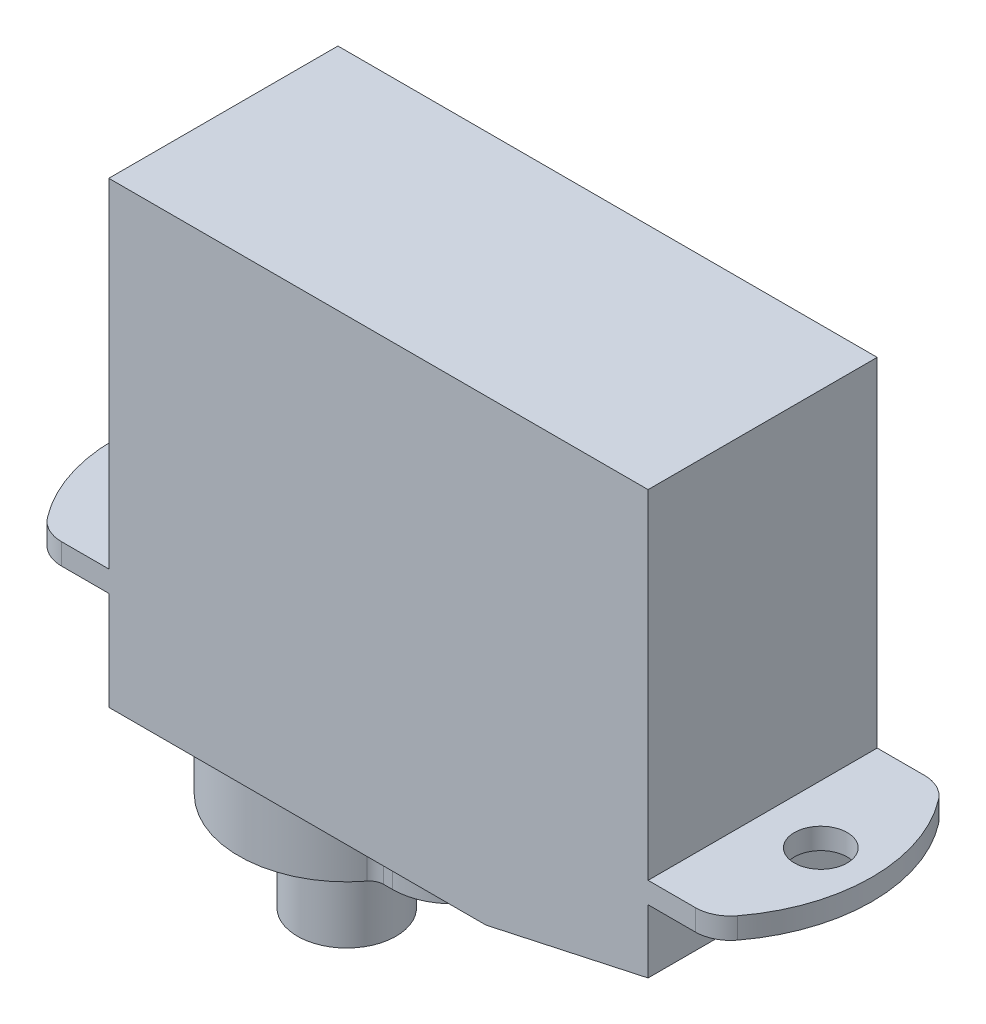
ISO-10303-21;
HEADER;
FILE_DESCRIPTION(('STEP AP214'),'2;1');
FILE_NAME('part.step','',(''),(''),'','','');
FILE_SCHEMA(('AUTOMOTIVE_DESIGN { 1 0 10303 214 1 1 1 1 }'));
ENDSEC;
DATA;
#1=APPLICATION_CONTEXT('core data for automotive mechanical design processes');
#2=APPLICATION_PROTOCOL_DEFINITION('international standard','automotive_design',2000,#1);
#3=PRODUCT_CONTEXT('',#1,'mechanical');
#4=PRODUCT('Part','Part','',(#3));
#5=PRODUCT_RELATED_PRODUCT_CATEGORY('part','',(#4));
#6=PRODUCT_DEFINITION_FORMATION('','',#4);
#7=PRODUCT_DEFINITION_CONTEXT('part definition',#1,'design');
#8=PRODUCT_DEFINITION('design','',#6,#7);
#9=PRODUCT_DEFINITION_SHAPE('','',#8);
#10=(LENGTH_UNIT() NAMED_UNIT(*) SI_UNIT(.MILLI.,.METRE.));
#11=(NAMED_UNIT(*) PLANE_ANGLE_UNIT() SI_UNIT($,.RADIAN.));
#12=(NAMED_UNIT(*) SI_UNIT($,.STERADIAN.) SOLID_ANGLE_UNIT());
#13=UNCERTAINTY_MEASURE_WITH_UNIT(LENGTH_MEASURE(1.E-05),#10,'distance_accuracy_value','');
#14=(GEOMETRIC_REPRESENTATION_CONTEXT(3) GLOBAL_UNCERTAINTY_ASSIGNED_CONTEXT((#13)) GLOBAL_UNIT_ASSIGNED_CONTEXT((#10,
#11,#12)) REPRESENTATION_CONTEXT('',''));
#15=CARTESIAN_POINT('',(0.,0.,0.));
#16=DIRECTION('',(0.,0.,1.));
#17=DIRECTION('',(1.,0.,0.));
#18=AXIS2_PLACEMENT_3D('',#15,#16,#17);
#19=CARTESIAN_POINT('',(-1.77820782436521,-2.54,-2.667));
#20=DIRECTION('',(0.,-1.,0.));
#21=DIRECTION('',(0.,0.,-1.));
#22=AXIS2_PLACEMENT_3D('',#19,#20,#21);
#23=PLANE('',#22);
#24=CARTESIAN_POINT('',(-1.77820782436521,-2.54,-2.667));
#25=DIRECTION('',(0.,1.,0.));
#26=DIRECTION('',(0.,0.,-1.));
#27=AXIS2_PLACEMENT_3D('',#24,#25,#26);
#28=CIRCLE('',#27,0.508);
#29=CARTESIAN_POINT('',(-2.18194102386056,-2.54,-2.35867630057804));
#30=VERTEX_POINT('',#29);
#31=CARTESIAN_POINT('',(-1.77820782436521,-2.54,-2.159));
#32=VERTEX_POINT('',#31);
#33=EDGE_CURVE('E201',#30,#32,#28,.T.);
#34=ORIENTED_EDGE('',*,*,#33,.T.);
#35=DIRECTION('',(1.,0.,0.));
#36=VECTOR('',#35,1.);
#37=CARTESIAN_POINT('',(-1.4605,-2.54,-2.159));
#38=LINE('',#37,#36);
#39=CARTESIAN_POINT('',(-1.4605,-2.54,-2.159));
#40=VERTEX_POINT('',#39);
#41=EDGE_CURVE('E190',#32,#40,#38,.T.);
#42=ORIENTED_EDGE('',*,*,#41,.T.);
#43=CARTESIAN_POINT('',(-1.4605,-2.54,0.));
#44=DIRECTION('',(0.,-1.,0.));
#45=DIRECTION('',(0.,0.,-1.));
#46=AXIS2_PLACEMENT_3D('',#43,#44,#45);
#47=CIRCLE('',#46,2.159);
#48=CARTESIAN_POINT('',(-1.4605,-2.54,2.159));
#49=VERTEX_POINT('',#48);
#50=EDGE_CURVE('E200',#40,#49,#47,.T.);
#51=ORIENTED_EDGE('',*,*,#50,.T.);
#52=DIRECTION('',(-1.,0.,0.));
#53=VECTOR('',#52,1.);
#54=CARTESIAN_POINT('',(-1.4605,-2.54,2.159));
#55=LINE('',#54,#53);
#56=CARTESIAN_POINT('',(-1.77820782436521,-2.54,2.159));
#57=VERTEX_POINT('',#56);
#58=EDGE_CURVE('E752',#49,#57,#55,.T.);
#59=ORIENTED_EDGE('',*,*,#58,.T.);
#60=CARTESIAN_POINT('',(-1.77820782436521,-2.54,2.667));
#61=DIRECTION('',(0.,1.,0.));
#62=DIRECTION('',(0.,0.,1.));
#63=AXIS2_PLACEMENT_3D('',#60,#61,#62);
#64=CIRCLE('',#63,0.508);
#65=CARTESIAN_POINT('',(-2.18194102386056,-2.54,2.35867630057803));
#66=VERTEX_POINT('',#65);
#67=EDGE_CURVE('E754',#57,#66,#64,.T.);
#68=ORIENTED_EDGE('',*,*,#67,.T.);
#69=CARTESIAN_POINT('',(-5.2705,-2.54,0.));
#70=DIRECTION('',(0.,-1.,0.));
#71=DIRECTION('',(0.,0.,-1.));
#72=AXIS2_PLACEMENT_3D('',#69,#70,#71);
#73=CIRCLE('',#72,3.8862);
#74=EDGE_CURVE('E206',#66,#30,#73,.T.);
#75=ORIENTED_EDGE('',*,*,#74,.T.);
#76=EDGE_LOOP('',(#34,#42,#51,#59,#68,#75));
#77=FACE_BOUND('',#76,.T.);
#78=CARTESIAN_POINT('',(-5.2705,-2.54,0.));
#79=DIRECTION('',(0.,-1.,0.));
#80=DIRECTION('',(0.,0.,-1.));
#81=AXIS2_PLACEMENT_3D('',#78,#79,#80);
#82=CIRCLE('',#81,1.778);
#83=CARTESIAN_POINT('',(-5.2705,-2.54,-1.778));
#84=VERTEX_POINT('',#83);
#85=EDGE_CURVE('E745',#84,#84,#82,.T.);
#86=ORIENTED_EDGE('',*,*,#85,.F.);
#87=EDGE_LOOP('',(#86));
#88=FACE_BOUND('',#87,.T.);
#89=ADVANCED_FACE('F35',(#77,#88),#23,.T.);
#90=CARTESIAN_POINT('',(0.,0.,0.));
#91=DIRECTION('',(0.,1.,0.));
#92=DIRECTION('',(0.,0.,1.));
#93=AXIS2_PLACEMENT_3D('',#90,#91,#92);
#94=PLANE('',#93);
#95=DIRECTION('',(-1.,0.,0.));
#96=VECTOR('',#95,1.);
#97=CARTESIAN_POINT('',(9.7155,0.,-4.1275));
#98=LINE('',#97,#96);
#99=CARTESIAN_POINT('',(3.87350000000001,0.,-4.1275025));
#100=VERTEX_POINT('',#99);
#101=CARTESIAN_POINT('',(-9.7155,0.,-4.1275));
#102=VERTEX_POINT('',#101);
#103=EDGE_CURVE('E39',#100,#102,#98,.T.);
#104=ORIENTED_EDGE('',*,*,#103,.F.);
#105=DIRECTION('',(0.,0.,1.));
#106=VECTOR('',#105,1.);
#107=CARTESIAN_POINT('',(3.8735,0.,0.));
#108=LINE('',#107,#106);
#109=CARTESIAN_POINT('',(3.8735,0.,4.1275));
#110=VERTEX_POINT('',#109);
#111=EDGE_CURVE('E11',#100,#110,#108,.T.);
#112=ORIENTED_EDGE('',*,*,#111,.T.);
#113=DIRECTION('',(1.,0.,0.));
#114=VECTOR('',#113,1.);
#115=CARTESIAN_POINT('',(9.7155,0.,4.1275));
#116=LINE('',#115,#114);
#117=CARTESIAN_POINT('',(-9.7155,0.,4.1275));
#118=VERTEX_POINT('',#117);
#119=EDGE_CURVE('E332',#118,#110,#116,.T.);
#120=ORIENTED_EDGE('',*,*,#119,.F.);
#121=DIRECTION('',(0.,0.,1.));
#122=VECTOR('',#121,1.);
#123=CARTESIAN_POINT('',(-9.7155,0.,4.1275));
#124=LINE('',#123,#122);
#125=EDGE_CURVE('E314',#102,#118,#124,.T.);
#126=ORIENTED_EDGE('',*,*,#125,.F.);
#127=EDGE_LOOP('',(#104,#112,#120,#126));
#128=FACE_BOUND('',#127,.T.);
#129=CARTESIAN_POINT('',(-1.77820782436521,0.,-2.667));
#130=DIRECTION('',(0.,1.,0.));
#131=DIRECTION('',(0.,0.,-1.));
#132=AXIS2_PLACEMENT_3D('',#129,#130,#131);
#133=CIRCLE('',#132,0.508);
#134=CARTESIAN_POINT('',(-2.18194102386056,0.,-2.35867630057804));
#135=VERTEX_POINT('',#134);
#136=CARTESIAN_POINT('',(-1.77820782436521,0.,-2.159));
#137=VERTEX_POINT('',#136);
#138=EDGE_CURVE('E213',#135,#137,#133,.T.);
#139=ORIENTED_EDGE('',*,*,#138,.F.);
#140=CARTESIAN_POINT('',(-5.2705,0.,0.));
#141=DIRECTION('',(0.,-1.,0.));
#142=DIRECTION('',(0.,0.,-1.));
#143=AXIS2_PLACEMENT_3D('',#140,#141,#142);
#144=CIRCLE('',#143,3.8862);
#145=CARTESIAN_POINT('',(-2.18194102386056,0.,2.35867630057803));
#146=VERTEX_POINT('',#145);
#147=EDGE_CURVE('E210',#146,#135,#144,.T.);
#148=ORIENTED_EDGE('',*,*,#147,.F.);
#149=CARTESIAN_POINT('',(-1.77820782436521,0.,2.667));
#150=DIRECTION('',(0.,1.,0.));
#151=DIRECTION('',(0.,0.,1.));
#152=AXIS2_PLACEMENT_3D('',#149,#150,#151);
#153=CIRCLE('',#152,0.508);
#154=CARTESIAN_POINT('',(-1.77820782436521,0.,2.159));
#155=VERTEX_POINT('',#154);
#156=EDGE_CURVE('E763',#155,#146,#153,.T.);
#157=ORIENTED_EDGE('',*,*,#156,.F.);
#158=DIRECTION('',(-1.,0.,0.));
#159=VECTOR('',#158,1.);
#160=CARTESIAN_POINT('',(-1.4605,0.,2.159));
#161=LINE('',#160,#159);
#162=CARTESIAN_POINT('',(-1.4605,0.,2.159));
#163=VERTEX_POINT('',#162);
#164=EDGE_CURVE('E760',#163,#155,#161,.T.);
#165=ORIENTED_EDGE('',*,*,#164,.F.);
#166=CARTESIAN_POINT('',(-1.4605,0.,0.));
#167=DIRECTION('',(0.,-1.,0.));
#168=DIRECTION('',(0.,0.,-1.));
#169=AXIS2_PLACEMENT_3D('',#166,#167,#168);
#170=CIRCLE('',#169,2.159);
#171=CARTESIAN_POINT('',(-1.4605,0.,-2.159));
#172=VERTEX_POINT('',#171);
#173=EDGE_CURVE('E58',#172,#163,#170,.T.);
#174=ORIENTED_EDGE('',*,*,#173,.F.);
#175=DIRECTION('',(1.,0.,0.));
#176=VECTOR('',#175,1.);
#177=CARTESIAN_POINT('',(-1.4605,0.,-2.159));
#178=LINE('',#177,#176);
#179=EDGE_CURVE('E53',#137,#172,#178,.T.);
#180=ORIENTED_EDGE('',*,*,#179,.F.);
#181=EDGE_LOOP('',(#139,#148,#157,#165,#174,#180));
#182=FACE_BOUND('',#181,.T.);
#183=ADVANCED_FACE('F379',(#128,#182),#94,.F.);
#184=CARTESIAN_POINT('',(-9.7155,16.51,4.1275));
#185=DIRECTION('',(1.,0.,0.));
#186=DIRECTION('',(0.,0.,-1.));
#187=AXIS2_PLACEMENT_3D('',#184,#185,#186);
#188=PLANE('',#187);
#189=DIRECTION('',(0.,0.,-1.));
#190=VECTOR('',#189,1.);
#191=CARTESIAN_POINT('',(-9.7155,4.318,-4.1275));
#192=LINE('',#191,#190);
#193=CARTESIAN_POINT('',(-9.7155,4.318,4.1275));
#194=VERTEX_POINT('',#193);
#195=CARTESIAN_POINT('',(-9.7155,4.318,-4.1275));
#196=VERTEX_POINT('',#195);
#197=EDGE_CURVE('E239',#194,#196,#192,.T.);
#198=ORIENTED_EDGE('',*,*,#197,.F.);
#199=DIRECTION('',(0.,-1.,0.));
#200=VECTOR('',#199,1.);
#201=CARTESIAN_POINT('',(-9.7155,16.51,4.1275));
#202=LINE('',#201,#200);
#203=CARTESIAN_POINT('',(-9.7155,16.51,4.1275));
#204=VERTEX_POINT('',#203);
#205=EDGE_CURVE('E45',#204,#194,#202,.T.);
#206=ORIENTED_EDGE('',*,*,#205,.F.);
#207=DIRECTION('',(0.,0.,1.));
#208=VECTOR('',#207,1.);
#209=CARTESIAN_POINT('',(-9.7155,16.51,4.1275));
#210=LINE('',#209,#208);
#211=CARTESIAN_POINT('',(-9.7155,16.51,-4.1275));
#212=VERTEX_POINT('',#211);
#213=EDGE_CURVE('E320',#212,#204,#210,.T.);
#214=ORIENTED_EDGE('',*,*,#213,.F.);
#215=DIRECTION('',(0.,-1.,0.));
#216=VECTOR('',#215,1.);
#217=CARTESIAN_POINT('',(-9.7155,16.51,-4.1275));
#218=LINE('',#217,#216);
#219=EDGE_CURVE('E343',#212,#196,#218,.T.);
#220=ORIENTED_EDGE('',*,*,#219,.T.);
#221=EDGE_LOOP('',(#198,#206,#214,#220));
#222=FACE_BOUND('',#221,.T.);
#223=ADVANCED_FACE('F418',(#222),#188,.F.);
#224=CARTESIAN_POINT('',(9.7155,16.51,4.1275));
#225=DIRECTION('',(-1.,0.,0.));
#226=DIRECTION('',(0.,0.,1.));
#227=AXIS2_PLACEMENT_3D('',#224,#225,#226);
#228=PLANE('',#227);
#229=DIRECTION('',(0.,0.,1.));
#230=VECTOR('',#229,1.);
#231=CARTESIAN_POINT('',(9.7155,4.318,4.1275));
#232=LINE('',#231,#230);
#233=CARTESIAN_POINT('',(9.7155,4.318,-4.1275));
#234=VERTEX_POINT('',#233);
#235=CARTESIAN_POINT('',(9.7155,4.318,4.1275));
#236=VERTEX_POINT('',#235);
#237=EDGE_CURVE('E294',#234,#236,#232,.T.);
#238=ORIENTED_EDGE('',*,*,#237,.F.);
#239=DIRECTION('',(0.,-1.,0.));
#240=VECTOR('',#239,1.);
#241=CARTESIAN_POINT('',(9.7155,16.51,-4.1275));
#242=LINE('',#241,#240);
#243=CARTESIAN_POINT('',(9.7155,16.51,-4.1275));
#244=VERTEX_POINT('',#243);
#245=EDGE_CURVE('E354',#244,#234,#242,.T.);
#246=ORIENTED_EDGE('',*,*,#245,.F.);
#247=DIRECTION('',(0.,0.,-1.));
#248=VECTOR('',#247,1.);
#249=CARTESIAN_POINT('',(9.7155,16.51,4.1275));
#250=LINE('',#249,#248);
#251=CARTESIAN_POINT('',(9.7155,16.51,4.1275));
#252=VERTEX_POINT('',#251);
#253=EDGE_CURVE('E325',#252,#244,#250,.T.);
#254=ORIENTED_EDGE('',*,*,#253,.F.);
#255=DIRECTION('',(0.,-1.,0.));
#256=VECTOR('',#255,1.);
#257=CARTESIAN_POINT('',(9.7155,16.51,4.1275));
#258=LINE('',#257,#256);
#259=EDGE_CURVE('E350',#252,#236,#258,.T.);
#260=ORIENTED_EDGE('',*,*,#259,.T.);
#261=EDGE_LOOP('',(#238,#246,#254,#260));
#262=FACE_BOUND('',#261,.T.);
#263=ADVANCED_FACE('F668',(#262),#228,.F.);
#264=CARTESIAN_POINT('',(-9.7155,3.556,4.1275));
#265=VERTEX_POINT('',#264);
#266=EDGE_CURVE('E347',#265,#118,#202,.T.);
#267=ORIENTED_EDGE('',*,*,#266,.F.);
#268=DIRECTION('',(0.,0.,-1.));
#269=VECTOR('',#268,1.);
#270=CARTESIAN_POINT('',(-9.7155,3.556,-4.1275));
#271=LINE('',#270,#269);
#272=CARTESIAN_POINT('',(-9.7155,3.556,-4.1275));
#273=VERTEX_POINT('',#272);
#274=EDGE_CURVE('E261',#265,#273,#271,.T.);
#275=ORIENTED_EDGE('',*,*,#274,.T.);
#276=EDGE_CURVE('E329',#273,#102,#218,.T.);
#277=ORIENTED_EDGE('',*,*,#276,.T.);
#278=ORIENTED_EDGE('',*,*,#125,.T.);
#279=EDGE_LOOP('',(#267,#275,#277,#278));
#280=FACE_BOUND('',#279,.T.);
#281=ADVANCED_FACE('F37',(#280),#188,.F.);
#282=CARTESIAN_POINT('',(9.7155,16.51,4.1275));
#283=DIRECTION('',(0.,0.,-1.));
#284=DIRECTION('',(-1.,0.,0.));
#285=AXIS2_PLACEMENT_3D('',#282,#283,#284);
#286=PLANE('',#285);
#287=ORIENTED_EDGE('',*,*,#119,.T.);
#288=DIRECTION('',(-0.977176363922801,-0.212429644331044,0.));
#289=VECTOR('',#288,1.);
#290=CARTESIAN_POINT('',(9.7155,1.27,4.1275));
#291=LINE('',#290,#289);
#292=CARTESIAN_POINT('',(9.7155,1.27,4.1275));
#293=VERTEX_POINT('',#292);
#294=EDGE_CURVE('E214',#293,#110,#291,.T.);
#295=ORIENTED_EDGE('',*,*,#294,.F.);
#296=CARTESIAN_POINT('',(9.7155,3.556,4.1275));
#297=VERTEX_POINT('',#296);
#298=EDGE_CURVE('E289',#297,#293,#258,.T.);
#299=ORIENTED_EDGE('',*,*,#298,.F.);
#300=DIRECTION('',(1.,0.,0.));
#301=VECTOR('',#300,1.);
#302=CARTESIAN_POINT('',(9.7155,3.556,4.1275));
#303=LINE('',#302,#301);
#304=CARTESIAN_POINT('',(11.4179236568572,3.556,4.1275));
#305=VERTEX_POINT('',#304);
#306=EDGE_CURVE('E272',#297,#305,#303,.T.);
#307=ORIENTED_EDGE('',*,*,#306,.T.);
#308=DIRECTION('',(0.,1.,0.));
#309=VECTOR('',#308,1.);
#310=CARTESIAN_POINT('',(11.4179236568572,3.556,4.1275));
#311=LINE('',#310,#309);
#312=CARTESIAN_POINT('',(11.4179236568572,4.318,4.1275));
#313=VERTEX_POINT('',#312);
#314=EDGE_CURVE('E288',#305,#313,#311,.T.);
#315=ORIENTED_EDGE('',*,*,#314,.T.);
#316=DIRECTION('',(1.,0.,0.));
#317=VECTOR('',#316,1.);
#318=CARTESIAN_POINT('',(9.7155,4.318,4.1275));
#319=LINE('',#318,#317);
#320=EDGE_CURVE('E265',#236,#313,#319,.T.);
#321=ORIENTED_EDGE('',*,*,#320,.F.);
#322=ORIENTED_EDGE('',*,*,#259,.F.);
#323=DIRECTION('',(1.,0.,0.));
#324=VECTOR('',#323,1.);
#325=CARTESIAN_POINT('',(9.7155,16.51,4.1275));
#326=LINE('',#325,#324);
#327=EDGE_CURVE('E323',#204,#252,#326,.T.);
#328=ORIENTED_EDGE('',*,*,#327,.F.);
#329=ORIENTED_EDGE('',*,*,#205,.T.);
#330=DIRECTION('',(1.,0.,0.));
#331=VECTOR('',#330,1.);
#332=CARTESIAN_POINT('',(-9.7155,4.318,4.1275));
#333=LINE('',#332,#331);
#334=CARTESIAN_POINT('',(-11.4179236568572,4.318,4.1275));
#335=VERTEX_POINT('',#334);
#336=EDGE_CURVE('E244',#335,#194,#333,.T.);
#337=ORIENTED_EDGE('',*,*,#336,.F.);
#338=DIRECTION('',(0.,1.,0.));
#339=VECTOR('',#338,1.);
#340=CARTESIAN_POINT('',(-11.4179236568572,3.556,4.1275));
#341=LINE('',#340,#339);
#342=CARTESIAN_POINT('',(-11.4179236568572,3.556,4.1275));
#343=VERTEX_POINT('',#342);
#344=EDGE_CURVE('E252',#343,#335,#341,.T.);
#345=ORIENTED_EDGE('',*,*,#344,.F.);
#346=DIRECTION('',(1.,0.,0.));
#347=VECTOR('',#346,1.);
#348=CARTESIAN_POINT('',(-9.7155,3.556,4.1275));
#349=LINE('',#348,#347);
#350=EDGE_CURVE('E392',#343,#265,#349,.T.);
#351=ORIENTED_EDGE('',*,*,#350,.T.);
#352=ORIENTED_EDGE('',*,*,#266,.T.);
#353=EDGE_LOOP('',(#287,#295,#299,#307,#315,#321,#322,#328,#329,#337,#345,#351,#352));
#354=FACE_BOUND('',#353,.T.);
#355=ADVANCED_FACE('F373',(#354),#286,.F.);
#356=ORIENTED_EDGE('',*,*,#298,.T.);
#357=DIRECTION('',(0.,0.,1.));
#358=VECTOR('',#357,1.);
#359=CARTESIAN_POINT('',(9.7155,1.27,-4.12755));
#360=LINE('',#359,#358);
#361=CARTESIAN_POINT('',(9.7155,1.27,-4.1275));
#362=VERTEX_POINT('',#361);
#363=EDGE_CURVE('E216',#362,#293,#360,.T.);
#364=ORIENTED_EDGE('',*,*,#363,.F.);
#365=CARTESIAN_POINT('',(9.7155,3.556,-4.1275));
#366=VERTEX_POINT('',#365);
#367=EDGE_CURVE('E346',#366,#362,#242,.T.);
#368=ORIENTED_EDGE('',*,*,#367,.F.);
#369=DIRECTION('',(0.,0.,1.));
#370=VECTOR('',#369,1.);
#371=CARTESIAN_POINT('',(9.7155,3.556,4.1275));
#372=LINE('',#371,#370);
#373=EDGE_CURVE('E284',#366,#297,#372,.T.);
#374=ORIENTED_EDGE('',*,*,#373,.T.);
#375=EDGE_LOOP('',(#356,#364,#368,#374));
#376=FACE_BOUND('',#375,.T.);
#377=ADVANCED_FACE('F368',(#376),#228,.F.);
#378=CARTESIAN_POINT('',(9.7155,16.51,-4.1275));
#379=DIRECTION('',(0.,0.,1.));
#380=DIRECTION('',(1.,0.,0.));
#381=AXIS2_PLACEMENT_3D('',#378,#379,#380);
#382=PLANE('',#381);
#383=ORIENTED_EDGE('',*,*,#367,.T.);
#384=DIRECTION('',(-0.977176363922801,-0.212429644331044,0.));
#385=VECTOR('',#384,1.);
#386=CARTESIAN_POINT('',(12.8790379061372,1.95772563176896,-4.1275));
#387=LINE('',#386,#385);
#388=EDGE_CURVE('E223',#362,#100,#387,.T.);
#389=ORIENTED_EDGE('',*,*,#388,.T.);
#390=ORIENTED_EDGE('',*,*,#103,.T.);
#391=ORIENTED_EDGE('',*,*,#276,.F.);
#392=DIRECTION('',(-1.,0.,0.));
#393=VECTOR('',#392,1.);
#394=CARTESIAN_POINT('',(-9.7155,3.556,-4.1275));
#395=LINE('',#394,#393);
#396=CARTESIAN_POINT('',(-11.4179236568572,3.556,-4.1275));
#397=VERTEX_POINT('',#396);
#398=EDGE_CURVE('E243',#273,#397,#395,.T.);
#399=ORIENTED_EDGE('',*,*,#398,.T.);
#400=DIRECTION('',(0.,1.,0.));
#401=VECTOR('',#400,1.);
#402=CARTESIAN_POINT('',(-11.4179236568572,3.556,-4.1275));
#403=LINE('',#402,#401);
#404=CARTESIAN_POINT('',(-11.4179236568572,4.318,-4.1275));
#405=VERTEX_POINT('',#404);
#406=EDGE_CURVE('E259',#397,#405,#403,.T.);
#407=ORIENTED_EDGE('',*,*,#406,.T.);
#408=DIRECTION('',(-1.,0.,0.));
#409=VECTOR('',#408,1.);
#410=CARTESIAN_POINT('',(-9.7155,4.318,-4.1275));
#411=LINE('',#410,#409);
#412=EDGE_CURVE('E235',#196,#405,#411,.T.);
#413=ORIENTED_EDGE('',*,*,#412,.F.);
#414=ORIENTED_EDGE('',*,*,#219,.F.);
#415=DIRECTION('',(-1.,0.,0.));
#416=VECTOR('',#415,1.);
#417=CARTESIAN_POINT('',(9.7155,16.51,-4.1275));
#418=LINE('',#417,#416);
#419=EDGE_CURVE('E327',#244,#212,#418,.T.);
#420=ORIENTED_EDGE('',*,*,#419,.F.);
#421=ORIENTED_EDGE('',*,*,#245,.T.);
#422=DIRECTION('',(-1.,0.,0.));
#423=VECTOR('',#422,1.);
#424=CARTESIAN_POINT('',(9.7155,4.318,-4.1275));
#425=LINE('',#424,#423);
#426=CARTESIAN_POINT('',(11.4179236568572,4.318,-4.1275));
#427=VERTEX_POINT('',#426);
#428=EDGE_CURVE('E300',#427,#234,#425,.T.);
#429=ORIENTED_EDGE('',*,*,#428,.F.);
#430=DIRECTION('',(0.,1.,0.));
#431=VECTOR('',#430,1.);
#432=CARTESIAN_POINT('',(11.4179236568572,3.556,-4.1275));
#433=LINE('',#432,#431);
#434=CARTESIAN_POINT('',(11.4179236568572,3.556,-4.1275));
#435=VERTEX_POINT('',#434);
#436=EDGE_CURVE('E312',#435,#427,#433,.T.);
#437=ORIENTED_EDGE('',*,*,#436,.F.);
#438=DIRECTION('',(-1.,0.,0.));
#439=VECTOR('',#438,1.);
#440=CARTESIAN_POINT('',(9.7155,3.556,-4.1275));
#441=LINE('',#440,#439);
#442=EDGE_CURVE('E278',#435,#366,#441,.T.);
#443=ORIENTED_EDGE('',*,*,#442,.T.);
#444=EDGE_LOOP('',(#383,#389,#390,#391,#399,#407,#413,#414,#420,#421,#429,#437,#443));
#445=FACE_BOUND('',#444,.T.);
#446=ADVANCED_FACE('F384',(#445),#382,.F.);
#447=CARTESIAN_POINT('',(0.,16.51,0.));
#448=DIRECTION('',(0.,1.,0.));
#449=DIRECTION('',(0.,0.,1.));
#450=AXIS2_PLACEMENT_3D('',#447,#448,#449);
#451=PLANE('',#450);
#452=ORIENTED_EDGE('',*,*,#213,.T.);
#453=ORIENTED_EDGE('',*,*,#327,.T.);
#454=ORIENTED_EDGE('',*,*,#253,.T.);
#455=ORIENTED_EDGE('',*,*,#419,.T.);
#456=EDGE_LOOP('',(#452,#453,#454,#455));
#457=FACE_BOUND('',#456,.T.);
#458=ADVANCED_FACE('F422',(#457),#451,.T.);
#459=CARTESIAN_POINT('',(11.4179236568572,3.556,-2.8575));
#460=DIRECTION('',(0.,1.,0.));
#461=DIRECTION('',(0.,0.,1.));
#462=AXIS2_PLACEMENT_3D('',#459,#460,#461);
#463=CYLINDRICAL_SURFACE('',#462,1.27);
#464=CARTESIAN_POINT('',(11.4179236568572,4.318,-2.8575));
#465=DIRECTION('',(0.,1.,0.));
#466=DIRECTION('',(0.,0.,-1.));
#467=AXIS2_PLACEMENT_3D('',#464,#465,#466);
#468=CIRCLE('',#467,1.27);
#469=CARTESIAN_POINT('',(12.4281051132497,4.318,-3.62719696969697));
#470=VERTEX_POINT('',#469);
#471=EDGE_CURVE('E302',#470,#427,#468,.T.);
#472=ORIENTED_EDGE('',*,*,#471,.F.);
#473=DIRECTION('',(0.,1.,0.));
#474=VECTOR('',#473,1.);
#475=CARTESIAN_POINT('',(12.4281051132497,3.556,-3.62719696969697));
#476=LINE('',#475,#474);
#477=CARTESIAN_POINT('',(12.4281051132497,3.556,-3.62719696969697));
#478=VERTEX_POINT('',#477);
#479=EDGE_CURVE('E315',#478,#470,#476,.T.);
#480=ORIENTED_EDGE('',*,*,#479,.F.);
#481=CARTESIAN_POINT('',(11.4179236568572,3.556,-2.8575));
#482=DIRECTION('',(0.,1.,0.));
#483=DIRECTION('',(0.,0.,-1.));
#484=AXIS2_PLACEMENT_3D('',#481,#482,#483);
#485=CIRCLE('',#484,1.27);
#486=EDGE_CURVE('E275',#478,#435,#485,.T.);
#487=ORIENTED_EDGE('',*,*,#486,.T.);
#488=ORIENTED_EDGE('',*,*,#436,.T.);
#489=EDGE_LOOP('',(#472,#480,#487,#488));
#490=FACE_BOUND('',#489,.T.);
#491=ADVANCED_FACE('F638',(#490),#463,.T.);
#492=CARTESIAN_POINT('',(7.667625,3.556,0.));
#493=DIRECTION('',(0.,1.,0.));
#494=DIRECTION('',(0.,0.,1.));
#495=AXIS2_PLACEMENT_3D('',#492,#493,#494);
#496=CYLINDRICAL_SURFACE('',#495,5.984875);
#497=CARTESIAN_POINT('',(7.667625,4.318,0.));
#498=DIRECTION('',(0.,1.,0.));
#499=DIRECTION('',(0.,0.,-1.));
#500=AXIS2_PLACEMENT_3D('',#497,#498,#499);
#501=CIRCLE('',#500,5.984875);
#502=CARTESIAN_POINT('',(12.4281051132497,4.318,3.62719696969697));
#503=VERTEX_POINT('',#502);
#504=EDGE_CURVE('E733',#503,#470,#501,.T.);
#505=ORIENTED_EDGE('',*,*,#504,.F.);
#506=DIRECTION('',(0.,1.,0.));
#507=VECTOR('',#506,1.);
#508=CARTESIAN_POINT('',(12.4281051132497,3.556,3.62719696969697));
#509=LINE('',#508,#507);
#510=CARTESIAN_POINT('',(12.4281051132497,3.556,3.62719696969697));
#511=VERTEX_POINT('',#510);
#512=EDGE_CURVE('E317',#511,#503,#509,.T.);
#513=ORIENTED_EDGE('',*,*,#512,.F.);
#514=CARTESIAN_POINT('',(7.667625,3.556,0.));
#515=DIRECTION('',(0.,1.,0.));
#516=DIRECTION('',(0.,0.,-1.));
#517=AXIS2_PLACEMENT_3D('',#514,#515,#516);
#518=CIRCLE('',#517,5.984875);
#519=EDGE_CURVE('E271',#511,#478,#518,.T.);
#520=ORIENTED_EDGE('',*,*,#519,.T.);
#521=ORIENTED_EDGE('',*,*,#479,.T.);
#522=EDGE_LOOP('',(#505,#513,#520,#521));
#523=FACE_BOUND('',#522,.T.);
#524=ADVANCED_FACE('F629',(#523),#496,.T.);
#525=CARTESIAN_POINT('',(11.4179236568572,3.556,2.8575));
#526=DIRECTION('',(0.,1.,0.));
#527=DIRECTION('',(0.,0.,1.));
#528=AXIS2_PLACEMENT_3D('',#525,#526,#527);
#529=CYLINDRICAL_SURFACE('',#528,1.27);
#530=CARTESIAN_POINT('',(11.4179236568572,4.318,2.8575));
#531=DIRECTION('',(0.,1.,0.));
#532=DIRECTION('',(0.,0.,1.));
#533=AXIS2_PLACEMENT_3D('',#530,#531,#532);
#534=CIRCLE('',#533,1.27);
#535=EDGE_CURVE('E281',#313,#503,#534,.T.);
#536=ORIENTED_EDGE('',*,*,#535,.F.);
#537=ORIENTED_EDGE('',*,*,#314,.F.);
#538=CARTESIAN_POINT('',(11.4179236568572,3.556,2.8575));
#539=DIRECTION('',(0.,1.,0.));
#540=DIRECTION('',(0.,0.,1.));
#541=AXIS2_PLACEMENT_3D('',#538,#539,#540);
#542=CIRCLE('',#541,1.27);
#543=EDGE_CURVE('E268',#305,#511,#542,.T.);
#544=ORIENTED_EDGE('',*,*,#543,.T.);
#545=ORIENTED_EDGE('',*,*,#512,.T.);
#546=EDGE_LOOP('',(#536,#537,#544,#545));
#547=FACE_BOUND('',#546,.T.);
#548=ADVANCED_FACE('F620',(#547),#529,.T.);
#549=CARTESIAN_POINT('',(11.4179236568572,3.556,2.8575));
#550=DIRECTION('',(0.,1.,0.));
#551=DIRECTION('',(0.,0.,1.));
#552=AXIS2_PLACEMENT_3D('',#549,#550,#551);
#553=PLANE('',#552);
#554=CARTESIAN_POINT('',(11.811,3.556,0.));
#555=DIRECTION('',(0.,1.,0.));
#556=DIRECTION('',(0.,0.,1.));
#557=AXIS2_PLACEMENT_3D('',#554,#555,#556);
#558=CIRCLE('',#557,0.9525);
#559=CARTESIAN_POINT('',(11.811,3.556,0.9525));
#560=VERTEX_POINT('',#559);
#561=EDGE_CURVE('E262',#560,#560,#558,.T.);
#562=ORIENTED_EDGE('',*,*,#561,.T.);
#563=EDGE_LOOP('',(#562));
#564=FACE_BOUND('',#563,.T.);
#565=ORIENTED_EDGE('',*,*,#306,.F.);
#566=ORIENTED_EDGE('',*,*,#373,.F.);
#567=ORIENTED_EDGE('',*,*,#442,.F.);
#568=ORIENTED_EDGE('',*,*,#486,.F.);
#569=ORIENTED_EDGE('',*,*,#519,.F.);
#570=ORIENTED_EDGE('',*,*,#543,.F.);
#571=EDGE_LOOP('',(#565,#566,#567,#568,#569,#570));
#572=FACE_BOUND('',#571,.T.);
#573=ADVANCED_FACE('F611',(#564,#572),#553,.F.);
#574=CARTESIAN_POINT('',(11.4179236568572,4.318,2.8575));
#575=DIRECTION('',(0.,1.,0.));
#576=DIRECTION('',(0.,0.,1.));
#577=AXIS2_PLACEMENT_3D('',#574,#575,#576);
#578=PLANE('',#577);
#579=CARTESIAN_POINT('',(11.811,4.318,0.));
#580=DIRECTION('',(0.,1.,0.));
#581=DIRECTION('',(0.,0.,1.));
#582=AXIS2_PLACEMENT_3D('',#579,#580,#581);
#583=CIRCLE('',#582,0.9525);
#584=CARTESIAN_POINT('',(11.811,4.318,0.9525));
#585=VERTEX_POINT('',#584);
#586=EDGE_CURVE('E254',#585,#585,#583,.T.);
#587=ORIENTED_EDGE('',*,*,#586,.F.);
#588=EDGE_LOOP('',(#587));
#589=FACE_BOUND('',#588,.T.);
#590=ORIENTED_EDGE('',*,*,#320,.T.);
#591=ORIENTED_EDGE('',*,*,#535,.T.);
#592=ORIENTED_EDGE('',*,*,#504,.T.);
#593=ORIENTED_EDGE('',*,*,#471,.T.);
#594=ORIENTED_EDGE('',*,*,#428,.T.);
#595=ORIENTED_EDGE('',*,*,#237,.T.);
#596=EDGE_LOOP('',(#590,#591,#592,#593,#594,#595));
#597=FACE_BOUND('',#596,.T.);
#598=ADVANCED_FACE('F602',(#589,#597),#578,.T.);
#599=CARTESIAN_POINT('',(11.811,3.556,0.));
#600=DIRECTION('',(0.,1.,0.));
#601=DIRECTION('',(0.,0.,1.));
#602=AXIS2_PLACEMENT_3D('',#599,#600,#601);
#603=CYLINDRICAL_SURFACE('',#602,0.9525);
#604=CARTESIAN_POINT('',(11.811,3.556,0.9525));
#605=CARTESIAN_POINT('',(11.811,3.5639375,0.9525));
#606=CARTESIAN_POINT('',(11.811,3.571875,0.9525));
#607=CARTESIAN_POINT('',(11.811,3.58775,0.9525));
#608=CARTESIAN_POINT('',(11.811,3.5956875,0.9525));
#609=CARTESIAN_POINT('',(11.811,3.6115625,0.9525));
#610=CARTESIAN_POINT('',(11.811,3.6195,0.9525));
#611=CARTESIAN_POINT('',(11.811,3.635375,0.9525));
#612=CARTESIAN_POINT('',(11.811,3.6433125,0.9525));
#613=CARTESIAN_POINT('',(11.811,3.6591875,0.9525));
#614=CARTESIAN_POINT('',(11.811,3.667125,0.9525));
#615=CARTESIAN_POINT('',(11.811,3.683,0.9525));
#616=CARTESIAN_POINT('',(11.811,3.6909375,0.9525));
#617=CARTESIAN_POINT('',(11.811,3.7068125,0.9525));
#618=CARTESIAN_POINT('',(11.811,3.71475,0.9525));
#619=CARTESIAN_POINT('',(11.811,3.730625,0.9525));
#620=CARTESIAN_POINT('',(11.811,3.7385625,0.9525));
#621=CARTESIAN_POINT('',(11.811,3.7544375,0.9525));
#622=CARTESIAN_POINT('',(11.811,3.762375,0.9525));
#623=CARTESIAN_POINT('',(11.811,3.77825,0.9525));
#624=CARTESIAN_POINT('',(11.811,3.7861875,0.9525));
#625=CARTESIAN_POINT('',(11.811,3.8020625,0.9525));
#626=CARTESIAN_POINT('',(11.811,3.81,0.9525));
#627=CARTESIAN_POINT('',(11.811,3.825875,0.9525));
#628=CARTESIAN_POINT('',(11.811,3.8338125,0.9525));
#629=CARTESIAN_POINT('',(11.811,3.8496875,0.9525));
#630=CARTESIAN_POINT('',(11.811,3.857625,0.9525));
#631=CARTESIAN_POINT('',(11.811,3.8735,0.9525));
#632=CARTESIAN_POINT('',(11.811,3.8814375,0.9525));
#633=CARTESIAN_POINT('',(11.811,3.8973125,0.9525));
#634=CARTESIAN_POINT('',(11.811,3.90525,0.9525));
#635=CARTESIAN_POINT('',(11.811,3.921125,0.9525));
#636=CARTESIAN_POINT('',(11.811,3.9290625,0.9525));
#637=CARTESIAN_POINT('',(11.811,3.9449375,0.9525));
#638=CARTESIAN_POINT('',(11.811,3.952875,0.9525));
#639=CARTESIAN_POINT('',(11.811,3.96875,0.9525));
#640=CARTESIAN_POINT('',(11.811,3.9766875,0.9525));
#641=CARTESIAN_POINT('',(11.811,3.9925625,0.9525));
#642=CARTESIAN_POINT('',(11.811,4.0005,0.9525));
#643=CARTESIAN_POINT('',(11.811,4.016375,0.9525));
#644=CARTESIAN_POINT('',(11.811,4.0243125,0.9525));
#645=CARTESIAN_POINT('',(11.811,4.0401875,0.9525));
#646=CARTESIAN_POINT('',(11.811,4.048125,0.9525));
#647=CARTESIAN_POINT('',(11.811,4.064,0.9525));
#648=CARTESIAN_POINT('',(11.811,4.0719375,0.9525));
#649=CARTESIAN_POINT('',(11.811,4.0878125,0.9525));
#650=CARTESIAN_POINT('',(11.811,4.09575,0.9525));
#651=CARTESIAN_POINT('',(11.811,4.111625,0.9525));
#652=CARTESIAN_POINT('',(11.811,4.1195625,0.9525));
#653=CARTESIAN_POINT('',(11.811,4.1354375,0.9525));
#654=CARTESIAN_POINT('',(11.811,4.143375,0.9525));
#655=CARTESIAN_POINT('',(11.811,4.15925,0.9525));
#656=CARTESIAN_POINT('',(11.811,4.1671875,0.9525));
#657=CARTESIAN_POINT('',(11.811,4.1830625,0.9525));
#658=CARTESIAN_POINT('',(11.811,4.191,0.9525));
#659=CARTESIAN_POINT('',(11.811,4.206875,0.9525));
#660=CARTESIAN_POINT('',(11.811,4.2148125,0.9525));
#661=CARTESIAN_POINT('',(11.811,4.2306875,0.9525));
#662=CARTESIAN_POINT('',(11.811,4.238625,0.9525));
#663=CARTESIAN_POINT('',(11.811,4.2545,0.9525));
#664=CARTESIAN_POINT('',(11.811,4.2624375,0.9525));
#665=CARTESIAN_POINT('',(11.811,4.2783125,0.9525));
#666=CARTESIAN_POINT('',(11.811,4.28625,0.9525));
#667=CARTESIAN_POINT('',(11.811,4.302125,0.9525));
#668=CARTESIAN_POINT('',(11.811,4.3100625,0.9525));
#669=CARTESIAN_POINT('',(11.811,4.318,0.9525));
#670=B_SPLINE_CURVE_WITH_KNOTS('',3,(#604,#605,#606,#607,#608,#609,#610,#611,#612,#613,#614,
#615,#616,#617,#618,#619,#620,#621,#622,#623,#624,#625,#626,#627,#628,#629,#630,#631,#632,#633,
#634,#635,#636,#637,#638,#639,#640,#641,#642,#643,#644,#645,#646,#647,#648,#649,#650,#651,#652,
#653,#654,#655,#656,#657,#658,#659,#660,#661,#662,#663,#664,#665,#666,#667,#668,#669),
.UNSPECIFIED.,.F.,.F.,(4,2,2,2,2,2,2,2,2,2,2,2,2,2,2,2,2,2,2,2,2,2,2,2,2,2,2,2,2,2,2,2,4),(0.,
0.0238125000000004,0.0476250000000004,0.0714375000000003,0.0952500000000003,0.1190625,0.142875,
0.1666875,0.1905,0.2143125,0.238125,0.2619375,0.28575,0.3095625,0.333375,0.3571875,0.381,
0.4048125,0.428625,0.4524375,0.47625,0.500062500000001,0.523875,0.5476875,0.5715,0.5953125,
0.619125,0.6429375,0.66675,0.6905625,0.714375,0.7381875,0.762),.UNSPECIFIED.);
#671=EDGE_CURVE('BSEAM594',#560,#585,#670,.T.);
#672=ORIENTED_EDGE('',*,*,#561,.F.);
#673=ORIENTED_EDGE('',*,*,#586,.T.);
#674=ORIENTED_EDGE('',*,*,#671,.T.);
#675=ORIENTED_EDGE('',*,*,#671,.F.);
#676=EDGE_LOOP('',(#672,#674,#673,#675));
#677=FACE_BOUND('',#676,.T.);
#678=ADVANCED_FACE('F594',(#677),#603,.F.);
#679=CARTESIAN_POINT('',(-11.4179236568572,3.556,2.8575));
#680=DIRECTION('',(0.,1.,0.));
#681=DIRECTION('',(0.,0.,1.));
#682=AXIS2_PLACEMENT_3D('',#679,#680,#681);
#683=CYLINDRICAL_SURFACE('',#682,1.27);
#684=CARTESIAN_POINT('',(-11.4179236568572,4.318,2.8575));
#685=DIRECTION('',(0.,1.,0.));
#686=DIRECTION('',(0.,0.,-1.));
#687=AXIS2_PLACEMENT_3D('',#684,#685,#686);
#688=CIRCLE('',#687,1.27);
#689=CARTESIAN_POINT('',(-12.4281051132497,4.318,3.62719696969697));
#690=VERTEX_POINT('',#689);
#691=EDGE_CURVE('E250',#690,#335,#688,.T.);
#692=ORIENTED_EDGE('',*,*,#691,.F.);
#693=DIRECTION('',(0.,1.,0.));
#694=VECTOR('',#693,1.);
#695=CARTESIAN_POINT('',(-12.4281051132497,3.556,3.62719696969697));
#696=LINE('',#695,#694);
#697=CARTESIAN_POINT('',(-12.4281051132497,3.556,3.62719696969697));
#698=VERTEX_POINT('',#697);
#699=EDGE_CURVE('E255',#698,#690,#696,.T.);
#700=ORIENTED_EDGE('',*,*,#699,.F.);
#701=CARTESIAN_POINT('',(-11.4179236568572,3.556,2.8575));
#702=DIRECTION('',(0.,1.,0.));
#703=DIRECTION('',(0.,0.,-1.));
#704=AXIS2_PLACEMENT_3D('',#701,#702,#703);
#705=CIRCLE('',#704,1.27);
#706=EDGE_CURVE('E393',#698,#343,#705,.T.);
#707=ORIENTED_EDGE('',*,*,#706,.T.);
#708=ORIENTED_EDGE('',*,*,#344,.T.);
#709=EDGE_LOOP('',(#692,#700,#707,#708));
#710=FACE_BOUND('',#709,.T.);
#711=ADVANCED_FACE('F439',(#710),#683,.T.);
#712=CARTESIAN_POINT('',(-7.667625,3.556,0.));
#713=DIRECTION('',(0.,1.,0.));
#714=DIRECTION('',(0.,0.,1.));
#715=AXIS2_PLACEMENT_3D('',#712,#713,#714);
#716=CYLINDRICAL_SURFACE('',#715,5.984875);
#717=CARTESIAN_POINT('',(-7.667625,4.318,0.));
#718=DIRECTION('',(0.,1.,0.));
#719=DIRECTION('',(0.,0.,1.));
#720=AXIS2_PLACEMENT_3D('',#717,#718,#719);
#721=CIRCLE('',#720,5.984875);
#722=CARTESIAN_POINT('',(-12.4281051132497,4.318,-3.62719696969697));
#723=VERTEX_POINT('',#722);
#724=EDGE_CURVE('E403',#723,#690,#721,.T.);
#725=ORIENTED_EDGE('',*,*,#724,.F.);
#726=DIRECTION('',(0.,1.,0.));
#727=VECTOR('',#726,1.);
#728=CARTESIAN_POINT('',(-12.4281051132497,3.556,-3.62719696969697));
#729=LINE('',#728,#727);
#730=CARTESIAN_POINT('',(-12.4281051132497,3.556,-3.62719696969697));
#731=VERTEX_POINT('',#730);
#732=EDGE_CURVE('E257',#731,#723,#729,.T.);
#733=ORIENTED_EDGE('',*,*,#732,.F.);
#734=CARTESIAN_POINT('',(-7.667625,3.556,0.));
#735=DIRECTION('',(0.,1.,0.));
#736=DIRECTION('',(0.,0.,1.));
#737=AXIS2_PLACEMENT_3D('',#734,#735,#736);
#738=CIRCLE('',#737,5.984875);
#739=EDGE_CURVE('E435',#731,#698,#738,.T.);
#740=ORIENTED_EDGE('',*,*,#739,.T.);
#741=ORIENTED_EDGE('',*,*,#699,.T.);
#742=EDGE_LOOP('',(#725,#733,#740,#741));
#743=FACE_BOUND('',#742,.T.);
#744=ADVANCED_FACE('F434',(#743),#716,.T.);
#745=CARTESIAN_POINT('',(-11.4179236568572,3.556,-2.8575));
#746=DIRECTION('',(0.,1.,0.));
#747=DIRECTION('',(0.,0.,1.));
#748=AXIS2_PLACEMENT_3D('',#745,#746,#747);
#749=CYLINDRICAL_SURFACE('',#748,1.27);
#750=CARTESIAN_POINT('',(-11.4179236568572,4.318,-2.8575));
#751=DIRECTION('',(0.,1.,0.));
#752=DIRECTION('',(0.,0.,-1.));
#753=AXIS2_PLACEMENT_3D('',#750,#751,#752);
#754=CIRCLE('',#753,1.27);
#755=EDGE_CURVE('E238',#405,#723,#754,.T.);
#756=ORIENTED_EDGE('',*,*,#755,.F.);
#757=ORIENTED_EDGE('',*,*,#406,.F.);
#758=CARTESIAN_POINT('',(-11.4179236568572,3.556,-2.8575));
#759=DIRECTION('',(0.,1.,0.));
#760=DIRECTION('',(0.,0.,-1.));
#761=AXIS2_PLACEMENT_3D('',#758,#759,#760);
#762=CIRCLE('',#761,1.27);
#763=EDGE_CURVE('E430',#397,#731,#762,.T.);
#764=ORIENTED_EDGE('',*,*,#763,.T.);
#765=ORIENTED_EDGE('',*,*,#732,.T.);
#766=EDGE_LOOP('',(#756,#757,#764,#765));
#767=FACE_BOUND('',#766,.T.);
#768=ADVANCED_FACE('F427',(#767),#749,.T.);
#769=CARTESIAN_POINT('',(-11.4179236568572,3.556,-2.8575));
#770=DIRECTION('',(0.,-1.,0.));
#771=DIRECTION('',(0.,0.,-1.));
#772=AXIS2_PLACEMENT_3D('',#769,#770,#771);
#773=PLANE('',#772);
#774=CARTESIAN_POINT('',(-11.811,3.556,0.));
#775=DIRECTION('',(0.,1.,0.));
#776=DIRECTION('',(0.,0.,1.));
#777=AXIS2_PLACEMENT_3D('',#774,#775,#776);
#778=CIRCLE('',#777,0.9525);
#779=CARTESIAN_POINT('',(-11.811,3.556,0.9525));
#780=VERTEX_POINT('',#779);
#781=EDGE_CURVE('E228',#780,#780,#778,.T.);
#782=ORIENTED_EDGE('',*,*,#781,.T.);
#783=EDGE_LOOP('',(#782));
#784=FACE_BOUND('',#783,.T.);
#785=ORIENTED_EDGE('',*,*,#398,.F.);
#786=ORIENTED_EDGE('',*,*,#274,.F.);
#787=ORIENTED_EDGE('',*,*,#350,.F.);
#788=ORIENTED_EDGE('',*,*,#706,.F.);
#789=ORIENTED_EDGE('',*,*,#739,.F.);
#790=ORIENTED_EDGE('',*,*,#763,.F.);
#791=EDGE_LOOP('',(#785,#786,#787,#788,#789,#790));
#792=FACE_BOUND('',#791,.T.);
#793=ADVANCED_FACE('F440',(#784,#792),#773,.T.);
#794=CARTESIAN_POINT('',(-11.4179236568572,4.318,-2.8575));
#795=DIRECTION('',(0.,-1.,0.));
#796=DIRECTION('',(0.,0.,-1.));
#797=AXIS2_PLACEMENT_3D('',#794,#795,#796);
#798=PLANE('',#797);
#799=CARTESIAN_POINT('',(-11.811,4.318,0.));
#800=DIRECTION('',(0.,1.,0.));
#801=DIRECTION('',(0.,0.,1.));
#802=AXIS2_PLACEMENT_3D('',#799,#800,#801);
#803=CIRCLE('',#802,0.9525);
#804=CARTESIAN_POINT('',(-11.811,4.318,0.9525));
#805=VERTEX_POINT('',#804);
#806=EDGE_CURVE('E227',#805,#805,#803,.T.);
#807=ORIENTED_EDGE('',*,*,#806,.F.);
#808=EDGE_LOOP('',(#807));
#809=FACE_BOUND('',#808,.T.);
#810=ORIENTED_EDGE('',*,*,#412,.T.);
#811=ORIENTED_EDGE('',*,*,#755,.T.);
#812=ORIENTED_EDGE('',*,*,#724,.T.);
#813=ORIENTED_EDGE('',*,*,#691,.T.);
#814=ORIENTED_EDGE('',*,*,#336,.T.);
#815=ORIENTED_EDGE('',*,*,#197,.T.);
#816=EDGE_LOOP('',(#810,#811,#812,#813,#814,#815));
#817=FACE_BOUND('',#816,.T.);
#818=ADVANCED_FACE('F414',(#809,#817),#798,.F.);
#819=CARTESIAN_POINT('',(-11.811,3.556,0.));
#820=DIRECTION('',(0.,1.,0.));
#821=DIRECTION('',(0.,0.,1.));
#822=AXIS2_PLACEMENT_3D('',#819,#820,#821);
#823=CYLINDRICAL_SURFACE('',#822,0.9525);
#824=CARTESIAN_POINT('',(-11.811,3.556,0.9525));
#825=CARTESIAN_POINT('',(-11.811,3.5639375,0.9525));
#826=CARTESIAN_POINT('',(-11.811,3.571875,0.9525));
#827=CARTESIAN_POINT('',(-11.811,3.58775,0.9525));
#828=CARTESIAN_POINT('',(-11.811,3.5956875,0.9525));
#829=CARTESIAN_POINT('',(-11.811,3.6115625,0.9525));
#830=CARTESIAN_POINT('',(-11.811,3.6195,0.9525));
#831=CARTESIAN_POINT('',(-11.811,3.635375,0.9525));
#832=CARTESIAN_POINT('',(-11.811,3.6433125,0.9525));
#833=CARTESIAN_POINT('',(-11.811,3.6591875,0.9525));
#834=CARTESIAN_POINT('',(-11.811,3.667125,0.9525));
#835=CARTESIAN_POINT('',(-11.811,3.683,0.9525));
#836=CARTESIAN_POINT('',(-11.811,3.6909375,0.9525));
#837=CARTESIAN_POINT('',(-11.811,3.7068125,0.9525));
#838=CARTESIAN_POINT('',(-11.811,3.71475,0.9525));
#839=CARTESIAN_POINT('',(-11.811,3.730625,0.9525));
#840=CARTESIAN_POINT('',(-11.811,3.7385625,0.9525));
#841=CARTESIAN_POINT('',(-11.811,3.7544375,0.9525));
#842=CARTESIAN_POINT('',(-11.811,3.762375,0.9525));
#843=CARTESIAN_POINT('',(-11.811,3.77825,0.9525));
#844=CARTESIAN_POINT('',(-11.811,3.7861875,0.9525));
#845=CARTESIAN_POINT('',(-11.811,3.8020625,0.9525));
#846=CARTESIAN_POINT('',(-11.811,3.81,0.9525));
#847=CARTESIAN_POINT('',(-11.811,3.825875,0.9525));
#848=CARTESIAN_POINT('',(-11.811,3.8338125,0.9525));
#849=CARTESIAN_POINT('',(-11.811,3.8496875,0.9525));
#850=CARTESIAN_POINT('',(-11.811,3.857625,0.9525));
#851=CARTESIAN_POINT('',(-11.811,3.8735,0.9525));
#852=CARTESIAN_POINT('',(-11.811,3.8814375,0.9525));
#853=CARTESIAN_POINT('',(-11.811,3.8973125,0.9525));
#854=CARTESIAN_POINT('',(-11.811,3.90525,0.9525));
#855=CARTESIAN_POINT('',(-11.811,3.921125,0.9525));
#856=CARTESIAN_POINT('',(-11.811,3.9290625,0.9525));
#857=CARTESIAN_POINT('',(-11.811,3.9449375,0.9525));
#858=CARTESIAN_POINT('',(-11.811,3.952875,0.9525));
#859=CARTESIAN_POINT('',(-11.811,3.96875,0.9525));
#860=CARTESIAN_POINT('',(-11.811,3.9766875,0.9525));
#861=CARTESIAN_POINT('',(-11.811,3.9925625,0.9525));
#862=CARTESIAN_POINT('',(-11.811,4.0005,0.9525));
#863=CARTESIAN_POINT('',(-11.811,4.016375,0.9525));
#864=CARTESIAN_POINT('',(-11.811,4.0243125,0.9525));
#865=CARTESIAN_POINT('',(-11.811,4.0401875,0.9525));
#866=CARTESIAN_POINT('',(-11.811,4.048125,0.9525));
#867=CARTESIAN_POINT('',(-11.811,4.064,0.9525));
#868=CARTESIAN_POINT('',(-11.811,4.0719375,0.9525));
#869=CARTESIAN_POINT('',(-11.811,4.0878125,0.9525));
#870=CARTESIAN_POINT('',(-11.811,4.09575,0.9525));
#871=CARTESIAN_POINT('',(-11.811,4.111625,0.9525));
#872=CARTESIAN_POINT('',(-11.811,4.1195625,0.9525));
#873=CARTESIAN_POINT('',(-11.811,4.1354375,0.9525));
#874=CARTESIAN_POINT('',(-11.811,4.143375,0.9525));
#875=CARTESIAN_POINT('',(-11.811,4.15925,0.9525));
#876=CARTESIAN_POINT('',(-11.811,4.1671875,0.9525));
#877=CARTESIAN_POINT('',(-11.811,4.1830625,0.9525));
#878=CARTESIAN_POINT('',(-11.811,4.191,0.9525));
#879=CARTESIAN_POINT('',(-11.811,4.206875,0.9525));
#880=CARTESIAN_POINT('',(-11.811,4.2148125,0.9525));
#881=CARTESIAN_POINT('',(-11.811,4.2306875,0.9525));
#882=CARTESIAN_POINT('',(-11.811,4.238625,0.9525));
#883=CARTESIAN_POINT('',(-11.811,4.2545,0.9525));
#884=CARTESIAN_POINT('',(-11.811,4.2624375,0.9525));
#885=CARTESIAN_POINT('',(-11.811,4.2783125,0.9525));
#886=CARTESIAN_POINT('',(-11.811,4.28625,0.9525));
#887=CARTESIAN_POINT('',(-11.811,4.302125,0.9525));
#888=CARTESIAN_POINT('',(-11.811,4.3100625,0.9525));
#889=CARTESIAN_POINT('',(-11.811,4.318,0.9525));
#890=B_SPLINE_CURVE_WITH_KNOTS('',3,(#824,#825,#826,#827,#828,#829,#830,#831,#832,#833,#834,
#835,#836,#837,#838,#839,#840,#841,#842,#843,#844,#845,#846,#847,#848,#849,#850,#851,#852,#853,
#854,#855,#856,#857,#858,#859,#860,#861,#862,#863,#864,#865,#866,#867,#868,#869,#870,#871,#872,
#873,#874,#875,#876,#877,#878,#879,#880,#881,#882,#883,#884,#885,#886,#887,#888,#889),
.UNSPECIFIED.,.F.,.F.,(4,2,2,2,2,2,2,2,2,2,2,2,2,2,2,2,2,2,2,2,2,2,2,2,2,2,2,2,2,2,2,2,4),(0.,
0.0238125000000004,0.0476250000000004,0.0714375000000003,0.0952500000000003,0.1190625,0.142875,
0.1666875,0.1905,0.2143125,0.238125,0.2619375,0.28575,0.3095625,0.333375,0.3571875,0.381,
0.4048125,0.428625,0.4524375,0.47625,0.500062500000001,0.523875,0.5476875,0.5715,0.5953125,
0.619125,0.6429375,0.66675,0.6905625,0.714375,0.7381875,0.762),.UNSPECIFIED.);
#891=EDGE_CURVE('BSEAM449',#780,#805,#890,.T.);
#892=ORIENTED_EDGE('',*,*,#781,.F.);
#893=ORIENTED_EDGE('',*,*,#806,.T.);
#894=ORIENTED_EDGE('',*,*,#891,.T.);
#895=ORIENTED_EDGE('',*,*,#891,.F.);
#896=EDGE_LOOP('',(#892,#894,#893,#895));
#897=FACE_BOUND('',#896,.T.);
#898=ADVANCED_FACE('F449',(#897),#823,.F.);
#899=CARTESIAN_POINT('',(9.7155,1.27,-4.12755));
#900=DIRECTION('',(-0.212429644331044,0.977176363922801,0.));
#901=DIRECTION('',(-0.977176363922801,-0.212429644331044,0.));
#902=AXIS2_PLACEMENT_3D('',#899,#900,#901);
#903=PLANE('',#902);
#904=ORIENTED_EDGE('',*,*,#363,.T.);
#905=ORIENTED_EDGE('',*,*,#294,.T.);
#906=ORIENTED_EDGE('',*,*,#111,.F.);
#907=ORIENTED_EDGE('',*,*,#388,.F.);
#908=EDGE_LOOP('',(#904,#905,#906,#907));
#909=FACE_BOUND('',#908,.T.);
#910=ADVANCED_FACE('F376',(#909),#903,.F.);
#911=CARTESIAN_POINT('',(-1.77820782436521,-2.54,-2.667));
#912=DIRECTION('',(0.,1.,0.));
#913=DIRECTION('',(0.,0.,1.));
#914=AXIS2_PLACEMENT_3D('',#911,#912,#913);
#915=CYLINDRICAL_SURFACE('',#914,0.508);
#916=ORIENTED_EDGE('',*,*,#138,.T.);
#917=DIRECTION('',(0.,1.,0.));
#918=VECTOR('',#917,1.);
#919=CARTESIAN_POINT('',(-1.77820782436521,-2.54,-2.159));
#920=LINE('',#919,#918);
#921=EDGE_CURVE('E194',#32,#137,#920,.T.);
#922=ORIENTED_EDGE('',*,*,#921,.F.);
#923=ORIENTED_EDGE('',*,*,#33,.F.);
#924=DIRECTION('',(0.,1.,0.));
#925=VECTOR('',#924,1.);
#926=CARTESIAN_POINT('',(-2.18194102386056,-2.54,-2.35867630057804));
#927=LINE('',#926,#925);
#928=EDGE_CURVE('E756',#30,#135,#927,.T.);
#929=ORIENTED_EDGE('',*,*,#928,.T.);
#930=EDGE_LOOP('',(#916,#922,#923,#929));
#931=FACE_BOUND('',#930,.T.);
#932=ADVANCED_FACE('F212',(#931),#915,.F.);
#933=CARTESIAN_POINT('',(-1.4605,-2.54,-2.159));
#934=DIRECTION('',(0.,0.,1.));
#935=DIRECTION('',(1.,0.,0.));
#936=AXIS2_PLACEMENT_3D('',#933,#934,#935);
#937=PLANE('',#936);
#938=ORIENTED_EDGE('',*,*,#179,.T.);
#939=DIRECTION('',(0.,1.,0.));
#940=VECTOR('',#939,1.);
#941=CARTESIAN_POINT('',(-1.4605,-2.54,-2.159));
#942=LINE('',#941,#940);
#943=EDGE_CURVE('E197',#40,#172,#942,.T.);
#944=ORIENTED_EDGE('',*,*,#943,.F.);
#945=ORIENTED_EDGE('',*,*,#41,.F.);
#946=ORIENTED_EDGE('',*,*,#921,.T.);
#947=EDGE_LOOP('',(#938,#944,#945,#946));
#948=FACE_BOUND('',#947,.T.);
#949=ADVANCED_FACE('F192',(#948),#937,.F.);
#950=CARTESIAN_POINT('',(-1.4605,-2.54,0.));
#951=DIRECTION('',(0.,1.,0.));
#952=DIRECTION('',(0.,0.,1.));
#953=AXIS2_PLACEMENT_3D('',#950,#951,#952);
#954=CYLINDRICAL_SURFACE('',#953,2.159);
#955=ORIENTED_EDGE('',*,*,#173,.T.);
#956=DIRECTION('',(0.,1.,0.));
#957=VECTOR('',#956,1.);
#958=CARTESIAN_POINT('',(-1.4605,-2.54,2.159));
#959=LINE('',#958,#957);
#960=EDGE_CURVE('E218',#49,#163,#959,.T.);
#961=ORIENTED_EDGE('',*,*,#960,.F.);
#962=ORIENTED_EDGE('',*,*,#50,.F.);
#963=ORIENTED_EDGE('',*,*,#943,.T.);
#964=EDGE_LOOP('',(#955,#961,#962,#963));
#965=FACE_BOUND('',#964,.T.);
#966=ADVANCED_FACE('F481',(#965),#954,.T.);
#967=CARTESIAN_POINT('',(-1.4605,-2.54,2.159));
#968=DIRECTION('',(0.,0.,-1.));
#969=DIRECTION('',(-1.,0.,0.));
#970=AXIS2_PLACEMENT_3D('',#967,#968,#969);
#971=PLANE('',#970);
#972=ORIENTED_EDGE('',*,*,#164,.T.);
#973=DIRECTION('',(0.,1.,0.));
#974=VECTOR('',#973,1.);
#975=CARTESIAN_POINT('',(-1.77820782436521,-2.54,2.159));
#976=LINE('',#975,#974);
#977=EDGE_CURVE('E772',#57,#155,#976,.T.);
#978=ORIENTED_EDGE('',*,*,#977,.F.);
#979=ORIENTED_EDGE('',*,*,#58,.F.);
#980=ORIENTED_EDGE('',*,*,#960,.T.);
#981=EDGE_LOOP('',(#972,#978,#979,#980));
#982=FACE_BOUND('',#981,.T.);
#983=ADVANCED_FACE('F477',(#982),#971,.F.);
#984=CARTESIAN_POINT('',(-1.77820782436521,-2.54,2.667));
#985=DIRECTION('',(0.,1.,0.));
#986=DIRECTION('',(0.,0.,1.));
#987=AXIS2_PLACEMENT_3D('',#984,#985,#986);
#988=CYLINDRICAL_SURFACE('',#987,0.508);
#989=ORIENTED_EDGE('',*,*,#156,.T.);
#990=DIRECTION('',(0.,1.,0.));
#991=VECTOR('',#990,1.);
#992=CARTESIAN_POINT('',(-2.18194102386056,-2.54,2.35867630057803));
#993=LINE('',#992,#991);
#994=EDGE_CURVE('E769',#66,#146,#993,.T.);
#995=ORIENTED_EDGE('',*,*,#994,.F.);
#996=ORIENTED_EDGE('',*,*,#67,.F.);
#997=ORIENTED_EDGE('',*,*,#977,.T.);
#998=EDGE_LOOP('',(#989,#995,#996,#997));
#999=FACE_BOUND('',#998,.T.);
#1000=ADVANCED_FACE('F473',(#999),#988,.F.);
#1001=CARTESIAN_POINT('',(-5.2705,-2.54,0.));
#1002=DIRECTION('',(0.,1.,0.));
#1003=DIRECTION('',(0.,0.,1.));
#1004=AXIS2_PLACEMENT_3D('',#1001,#1002,#1003);
#1005=CYLINDRICAL_SURFACE('',#1004,3.8862);
#1006=ORIENTED_EDGE('',*,*,#147,.T.);
#1007=ORIENTED_EDGE('',*,*,#928,.F.);
#1008=ORIENTED_EDGE('',*,*,#74,.F.);
#1009=ORIENTED_EDGE('',*,*,#994,.T.);
#1010=EDGE_LOOP('',(#1006,#1007,#1008,#1009));
#1011=FACE_BOUND('',#1010,.T.);
#1012=ADVANCED_FACE('F470',(#1011),#1005,.T.);
#1013=CARTESIAN_POINT('',(-5.2705,-6.096,0.));
#1014=DIRECTION('',(0.,1.,0.));
#1015=DIRECTION('',(0.,0.,1.));
#1016=AXIS2_PLACEMENT_3D('',#1013,#1014,#1015);
#1017=CYLINDRICAL_SURFACE('',#1016,1.778);
#1018=CARTESIAN_POINT('',(-5.2705,-6.096,0.));
#1019=DIRECTION('',(0.,-1.,0.));
#1020=DIRECTION('',(0.,0.,-1.));
#1021=AXIS2_PLACEMENT_3D('',#1018,#1019,#1020);
#1022=CIRCLE('',#1021,1.778);
#1023=CARTESIAN_POINT('',(-5.2705,-6.096,-1.778));
#1024=VERTEX_POINT('',#1023);
#1025=EDGE_CURVE('E744',#1024,#1024,#1022,.T.);
#1026=ORIENTED_EDGE('',*,*,#1025,.F.);
#1027=EDGE_LOOP('',(#1026));
#1028=FACE_BOUND('',#1027,.T.);
#1029=ORIENTED_EDGE('',*,*,#85,.T.);
#1030=EDGE_LOOP('',(#1029));
#1031=FACE_BOUND('',#1030,.T.);
#1032=ADVANCED_FACE('F468',(#1028,#1031),#1017,.T.);
#1033=CARTESIAN_POINT('',(-5.2705,-6.096,0.));
#1034=DIRECTION('',(0.,-1.,0.));
#1035=DIRECTION('',(0.,0.,-1.));
#1036=AXIS2_PLACEMENT_3D('',#1033,#1034,#1035);
#1037=PLANE('',#1036);
#1038=ORIENTED_EDGE('',*,*,#1025,.T.);
#1039=EDGE_LOOP('',(#1038));
#1040=FACE_BOUND('',#1039,.T.);
#1041=ADVANCED_FACE('F520',(#1040),#1037,.T.);
#1042=CLOSED_SHELL('',(#89,#183,#223,#263,#281,#355,#377,#446,#458,#491,#524,#548,#573,#598,
#678,#711,#744,#768,#793,#818,#898,#910,#932,#949,#966,#983,#1000,#1012,#1032,#1041));
#1043=MANIFOLD_SOLID_BREP('B2',#1042);
#1044=ADVANCED_BREP_SHAPE_REPRESENTATION('',(#18,#1043),#14);
#1045=SHAPE_DEFINITION_REPRESENTATION(#9,#1044);
ENDSEC;
END-ISO-10303-21;
